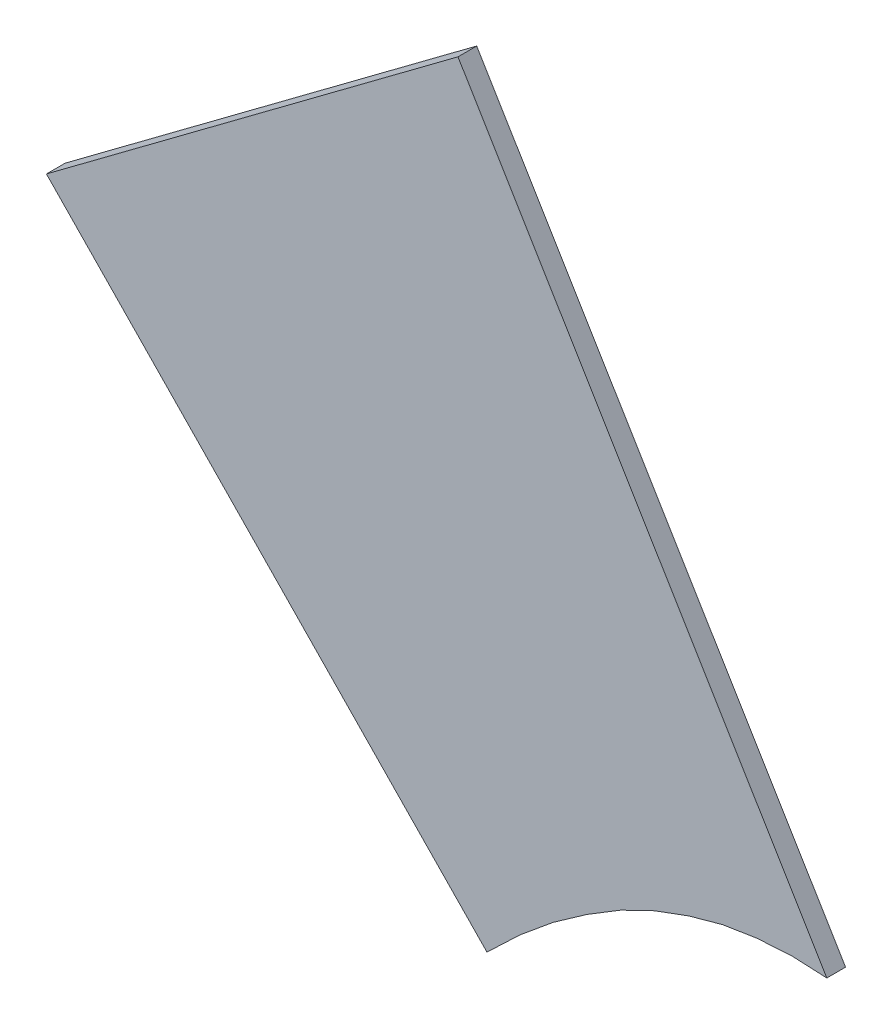
ISO-10303-21;
HEADER;
FILE_DESCRIPTION(('STEP AP214'),'2;1');
FILE_NAME('part.step','',(''),(''),'','','');
FILE_SCHEMA(('AUTOMOTIVE_DESIGN { 1 0 10303 214 1 1 1 1 }'));
ENDSEC;
DATA;
#1=APPLICATION_CONTEXT('core data for automotive mechanical design processes');
#2=APPLICATION_PROTOCOL_DEFINITION('international standard','automotive_design',2000,#1);
#3=PRODUCT_CONTEXT('',#1,'mechanical');
#4=PRODUCT('Part','Part','',(#3));
#5=PRODUCT_RELATED_PRODUCT_CATEGORY('part','',(#4));
#6=PRODUCT_DEFINITION_FORMATION('','',#4);
#7=PRODUCT_DEFINITION_CONTEXT('part definition',#1,'design');
#8=PRODUCT_DEFINITION('design','',#6,#7);
#9=PRODUCT_DEFINITION_SHAPE('','',#8);
#10=(LENGTH_UNIT() NAMED_UNIT(*) SI_UNIT(.MILLI.,.METRE.));
#11=(NAMED_UNIT(*) PLANE_ANGLE_UNIT() SI_UNIT($,.RADIAN.));
#12=(NAMED_UNIT(*) SI_UNIT($,.STERADIAN.) SOLID_ANGLE_UNIT());
#13=UNCERTAINTY_MEASURE_WITH_UNIT(LENGTH_MEASURE(1.E-05),#10,'distance_accuracy_value','');
#14=(GEOMETRIC_REPRESENTATION_CONTEXT(3) GLOBAL_UNCERTAINTY_ASSIGNED_CONTEXT((#13)) GLOBAL_UNIT_ASSIGNED_CONTEXT((#10,
#11,#12)) REPRESENTATION_CONTEXT('',''));
#15=CARTESIAN_POINT('',(0.,0.,0.));
#16=DIRECTION('',(0.,0.,1.));
#17=DIRECTION('',(1.,0.,0.));
#18=AXIS2_PLACEMENT_3D('',#15,#16,#17);
#19=CARTESIAN_POINT('',(35.1240005493164,69.875,0.));
#20=DIRECTION('',(-0.689642033528517,0.724150444031247,0.));
#21=DIRECTION('',(0.724150444031247,0.689642033528517,0.));
#22=AXIS2_PLACEMENT_3D('',#19,#20,#21);
#23=PLANE('',#22);
#24=DIRECTION('',(0.724150444031247,0.689642033528517,0.));
#25=VECTOR('',#24,1.);
#26=CARTESIAN_POINT('',(35.1240005493164,69.875,0.03556));
#27=LINE('',#26,#25);
#28=CARTESIAN_POINT('',(35.1240005493164,69.875,0.03556));
#29=VERTEX_POINT('',#28);
#30=CARTESIAN_POINT('',(35.1870002746582,69.9349975585938,0.03556));
#31=VERTEX_POINT('',#30);
#32=EDGE_CURVE('E11',#29,#31,#27,.T.);
#33=ORIENTED_EDGE('',*,*,#32,.F.);
#34=DIRECTION('',(0.,0.,1.));
#35=VECTOR('',#34,1.);
#36=CARTESIAN_POINT('',(35.1240005493164,69.875,0.));
#37=LINE('',#36,#35);
#38=CARTESIAN_POINT('',(35.1240005493164,69.875,0.));
#39=VERTEX_POINT('',#38);
#40=EDGE_CURVE('E24',#39,#29,#37,.T.);
#41=ORIENTED_EDGE('',*,*,#40,.F.);
#42=DIRECTION('',(0.724150444031247,0.689642033528517,0.));
#43=VECTOR('',#42,1.);
#44=CARTESIAN_POINT('',(35.1240005493164,69.875,0.));
#45=LINE('',#44,#43);
#46=CARTESIAN_POINT('',(35.1870002746582,69.9349975585938,0.));
#47=VERTEX_POINT('',#46);
#48=EDGE_CURVE('E130',#39,#47,#45,.T.);
#49=ORIENTED_EDGE('',*,*,#48,.T.);
#50=DIRECTION('',(0.,0.,1.));
#51=VECTOR('',#50,1.);
#52=CARTESIAN_POINT('',(35.1870002746582,69.9349975585938,0.));
#53=LINE('',#52,#51);
#54=EDGE_CURVE('E37',#47,#31,#53,.T.);
#55=ORIENTED_EDGE('',*,*,#54,.T.);
#56=EDGE_LOOP('',(#33,#41,#49,#55));
#57=FACE_BOUND('',#56,.T.);
#58=ADVANCED_FACE('F17',(#57),#23,.F.);
#59=CARTESIAN_POINT('',(35.1870002746582,69.9349975585938,0.));
#60=DIRECTION('',(-0.636580907801203,0.771209924613913,0.));
#61=DIRECTION('',(0.771209924613913,0.636580907801203,0.));
#62=AXIS2_PLACEMENT_3D('',#59,#60,#61);
#63=PLANE('',#62);
#64=DIRECTION('',(0.771209924613913,0.636580907801203,0.));
#65=VECTOR('',#64,1.);
#66=CARTESIAN_POINT('',(35.1870002746582,69.9349975585938,0.03556));
#67=LINE('',#66,#65);
#68=CARTESIAN_POINT('',(35.25,69.9869995117188,0.03556));
#69=VERTEX_POINT('',#68);
#70=EDGE_CURVE('E210',#31,#69,#67,.T.);
#71=ORIENTED_EDGE('',*,*,#70,.F.);
#72=ORIENTED_EDGE('',*,*,#54,.F.);
#73=DIRECTION('',(0.771209924613913,0.636580907801203,0.));
#74=VECTOR('',#73,1.);
#75=CARTESIAN_POINT('',(35.1870002746582,69.9349975585938,0.));
#76=LINE('',#75,#74);
#77=CARTESIAN_POINT('',(35.25,69.9869995117188,0.));
#78=VERTEX_POINT('',#77);
#79=EDGE_CURVE('E207',#47,#78,#76,.T.);
#80=ORIENTED_EDGE('',*,*,#79,.T.);
#81=DIRECTION('',(0.,0.,1.));
#82=VECTOR('',#81,1.);
#83=CARTESIAN_POINT('',(35.25,69.9869995117188,0.));
#84=LINE('',#83,#82);
#85=EDGE_CURVE('E205',#78,#69,#84,.T.);
#86=ORIENTED_EDGE('',*,*,#85,.T.);
#87=EDGE_LOOP('',(#71,#72,#80,#86));
#88=FACE_BOUND('',#87,.T.);
#89=ADVANCED_FACE('F218',(#88),#63,.F.);
#90=CARTESIAN_POINT('',(35.25,69.9869995117188,0.));
#91=DIRECTION('',(-0.575166045740666,0.818036686113188,0.));
#92=DIRECTION('',(0.818036686113188,0.575166045740666,0.));
#93=AXIS2_PLACEMENT_3D('',#90,#91,#92);
#94=PLANE('',#93);
#95=DIRECTION('',(0.818036686113187,0.575166045740666,0.));
#96=VECTOR('',#95,1.);
#97=CARTESIAN_POINT('',(35.25,69.9869995117188,0.03556));
#98=LINE('',#97,#96);
#99=CARTESIAN_POINT('',(35.3139991760254,70.0319976806641,0.03556));
#100=VERTEX_POINT('',#99);
#101=EDGE_CURVE('E202',#69,#100,#98,.T.);
#102=ORIENTED_EDGE('',*,*,#101,.F.);
#103=ORIENTED_EDGE('',*,*,#85,.F.);
#104=DIRECTION('',(0.818036686113187,0.575166045740666,0.));
#105=VECTOR('',#104,1.);
#106=CARTESIAN_POINT('',(35.25,69.9869995117188,0.));
#107=LINE('',#106,#105);
#108=CARTESIAN_POINT('',(35.3139991760254,70.0319976806641,0.));
#109=VERTEX_POINT('',#108);
#110=EDGE_CURVE('E199',#78,#109,#107,.T.);
#111=ORIENTED_EDGE('',*,*,#110,.T.);
#112=DIRECTION('',(0.,0.,1.));
#113=VECTOR('',#112,1.);
#114=CARTESIAN_POINT('',(35.3139991760254,70.0319976806641,0.));
#115=LINE('',#114,#113);
#116=EDGE_CURVE('E197',#109,#100,#115,.T.);
#117=ORIENTED_EDGE('',*,*,#116,.T.);
#118=EDGE_LOOP('',(#102,#103,#111,#117));
#119=FACE_BOUND('',#118,.T.);
#120=ADVANCED_FACE('F224',(#119),#94,.F.);
#121=CARTESIAN_POINT('',(35.3139991760254,70.0319976806641,0.));
#122=DIRECTION('',(-0.520389310565312,0.853929133739656,0.));
#123=DIRECTION('',(0.853929133739656,0.520389310565312,0.));
#124=AXIS2_PLACEMENT_3D('',#121,#122,#123);
#125=PLANE('',#124);
#126=DIRECTION('',(0.853929133739656,0.520389310565312,0.));
#127=VECTOR('',#126,1.);
#128=CARTESIAN_POINT('',(35.3139991760254,70.0319976806641,0.03556));
#129=LINE('',#128,#127);
#130=CARTESIAN_POINT('',(35.3779983520508,70.0709991455078,0.03556));
#131=VERTEX_POINT('',#130);
#132=EDGE_CURVE('E194',#100,#131,#129,.T.);
#133=ORIENTED_EDGE('',*,*,#132,.F.);
#134=ORIENTED_EDGE('',*,*,#116,.F.);
#135=DIRECTION('',(0.853929133739656,0.520389310565312,0.));
#136=VECTOR('',#135,1.);
#137=CARTESIAN_POINT('',(35.3139991760254,70.0319976806641,0.));
#138=LINE('',#137,#136);
#139=CARTESIAN_POINT('',(35.3779983520508,70.0709991455078,0.));
#140=VERTEX_POINT('',#139);
#141=EDGE_CURVE('E191',#109,#140,#138,.T.);
#142=ORIENTED_EDGE('',*,*,#141,.T.);
#143=DIRECTION('',(0.,0.,1.));
#144=VECTOR('',#143,1.);
#145=CARTESIAN_POINT('',(35.3779983520508,70.0709991455078,0.));
#146=LINE('',#145,#144);
#147=EDGE_CURVE('E189',#140,#131,#146,.T.);
#148=ORIENTED_EDGE('',*,*,#147,.T.);
#149=EDGE_LOOP('',(#133,#134,#142,#148));
#150=FACE_BOUND('',#149,.T.);
#151=ADVANCED_FACE('F226',(#150),#125,.F.);
#152=CARTESIAN_POINT('',(35.3779983520508,70.0709991455078,0.));
#153=DIRECTION('',(-0.435891794193045,0.899999079863512,0.));
#154=DIRECTION('',(0.899999079863512,0.435891794193045,0.));
#155=AXIS2_PLACEMENT_3D('',#152,#153,#154);
#156=PLANE('',#155);
#157=DIRECTION('',(0.899999079863512,0.435891794193045,0.));
#158=VECTOR('',#157,1.);
#159=CARTESIAN_POINT('',(35.3779983520508,70.0709991455078,0.03556));
#160=LINE('',#159,#158);
#161=CARTESIAN_POINT('',(35.4420013427734,70.1019973754883,0.03556));
#162=VERTEX_POINT('',#161);
#163=EDGE_CURVE('E186',#131,#162,#160,.T.);
#164=ORIENTED_EDGE('',*,*,#163,.F.);
#165=ORIENTED_EDGE('',*,*,#147,.F.);
#166=DIRECTION('',(0.899999079863512,0.435891794193045,0.));
#167=VECTOR('',#166,1.);
#168=CARTESIAN_POINT('',(35.3779983520508,70.0709991455078,0.));
#169=LINE('',#168,#167);
#170=CARTESIAN_POINT('',(35.4420013427734,70.1019973754883,0.));
#171=VERTEX_POINT('',#170);
#172=EDGE_CURVE('E183',#140,#171,#169,.T.);
#173=ORIENTED_EDGE('',*,*,#172,.T.);
#174=DIRECTION('',(0.,0.,1.));
#175=VECTOR('',#174,1.);
#176=CARTESIAN_POINT('',(35.4420013427734,70.1019973754883,0.));
#177=LINE('',#176,#175);
#178=EDGE_CURVE('E181',#171,#162,#177,.T.);
#179=ORIENTED_EDGE('',*,*,#178,.T.);
#180=EDGE_LOOP('',(#164,#165,#173,#179));
#181=FACE_BOUND('',#180,.T.);
#182=ADVANCED_FACE('F231',(#181),#156,.F.);
#183=CARTESIAN_POINT('',(35.4420013427734,70.1019973754883,0.));
#184=DIRECTION('',(-0.346406879396561,0.938084363960266,0.));
#185=DIRECTION('',(0.938084363960266,0.346406879396561,0.));
#186=AXIS2_PLACEMENT_3D('',#183,#184,#185);
#187=PLANE('',#186);
#188=DIRECTION('',(0.938084363960266,0.346406879396561,0.));
#189=VECTOR('',#188,1.);
#190=CARTESIAN_POINT('',(35.4420013427734,70.1019973754883,0.03556));
#191=LINE('',#190,#189);
#192=CARTESIAN_POINT('',(35.5069999694824,70.1259994506836,0.03556));
#193=VERTEX_POINT('',#192);
#194=EDGE_CURVE('E178',#162,#193,#191,.T.);
#195=ORIENTED_EDGE('',*,*,#194,.F.);
#196=ORIENTED_EDGE('',*,*,#178,.F.);
#197=DIRECTION('',(0.938084363960266,0.346406879396561,0.));
#198=VECTOR('',#197,1.);
#199=CARTESIAN_POINT('',(35.4420013427734,70.1019973754883,0.));
#200=LINE('',#199,#198);
#201=CARTESIAN_POINT('',(35.5069999694824,70.1259994506836,0.));
#202=VERTEX_POINT('',#201);
#203=EDGE_CURVE('E175',#171,#202,#200,.T.);
#204=ORIENTED_EDGE('',*,*,#203,.T.);
#205=DIRECTION('',(0.,0.,1.));
#206=VECTOR('',#205,1.);
#207=CARTESIAN_POINT('',(35.5069999694824,70.1259994506836,0.));
#208=LINE('',#207,#206);
#209=EDGE_CURVE('E173',#202,#193,#208,.T.);
#210=ORIENTED_EDGE('',*,*,#209,.T.);
#211=EDGE_LOOP('',(#195,#196,#204,#210));
#212=FACE_BOUND('',#211,.T.);
#213=ADVANCED_FACE('F234',(#212),#187,.F.);
#214=CARTESIAN_POINT('',(35.5069999694824,70.1259994506836,0.));
#215=DIRECTION('',(-0.266853220896944,0.963737183311367,0.));
#216=DIRECTION('',(0.963737183311367,0.266853220896944,0.));
#217=AXIS2_PLACEMENT_3D('',#214,#215,#216);
#218=PLANE('',#217);
#219=DIRECTION('',(0.963737183311367,0.266853220896944,0.));
#220=VECTOR('',#219,1.);
#221=CARTESIAN_POINT('',(35.5069999694824,70.1259994506836,0.03556));
#222=LINE('',#221,#220);
#223=CARTESIAN_POINT('',(35.5719985961914,70.1439971923828,0.03556));
#224=VERTEX_POINT('',#223);
#225=EDGE_CURVE('E170',#193,#224,#222,.T.);
#226=ORIENTED_EDGE('',*,*,#225,.F.);
#227=ORIENTED_EDGE('',*,*,#209,.F.);
#228=DIRECTION('',(0.963737183311367,0.266853220896944,0.));
#229=VECTOR('',#228,1.);
#230=CARTESIAN_POINT('',(35.5069999694824,70.1259994506836,0.));
#231=LINE('',#230,#229);
#232=CARTESIAN_POINT('',(35.5719985961914,70.1439971923828,0.));
#233=VERTEX_POINT('',#232);
#234=EDGE_CURVE('E167',#202,#233,#231,.T.);
#235=ORIENTED_EDGE('',*,*,#234,.T.);
#236=DIRECTION('',(0.,0.,1.));
#237=VECTOR('',#236,1.);
#238=CARTESIAN_POINT('',(35.5719985961914,70.1439971923828,0.));
#239=LINE('',#238,#237);
#240=EDGE_CURVE('E165',#233,#224,#239,.T.);
#241=ORIENTED_EDGE('',*,*,#240,.T.);
#242=EDGE_LOOP('',(#226,#227,#235,#241));
#243=FACE_BOUND('',#242,.T.);
#244=ADVANCED_FACE('F239',(#243),#218,.F.);
#245=CARTESIAN_POINT('',(35.5719985961914,70.1439971923828,0.));
#246=DIRECTION('',(-0.152083335751154,0.98836767398919,0.));
#247=DIRECTION('',(0.98836767398919,0.152083335751154,0.));
#248=AXIS2_PLACEMENT_3D('',#245,#246,#247);
#249=PLANE('',#248);
#250=DIRECTION('',(0.98836767398919,0.152083335751153,0.));
#251=VECTOR('',#250,1.);
#252=CARTESIAN_POINT('',(35.5719985961914,70.1439971923828,0.03556));
#253=LINE('',#252,#251);
#254=CARTESIAN_POINT('',(35.6370010375977,70.1539993286133,0.03556));
#255=VERTEX_POINT('',#254);
#256=EDGE_CURVE('E162',#224,#255,#253,.T.);
#257=ORIENTED_EDGE('',*,*,#256,.F.);
#258=ORIENTED_EDGE('',*,*,#240,.F.);
#259=DIRECTION('',(0.98836767398919,0.152083335751153,0.));
#260=VECTOR('',#259,1.);
#261=CARTESIAN_POINT('',(35.5719985961914,70.1439971923828,0.));
#262=LINE('',#261,#260);
#263=CARTESIAN_POINT('',(35.6370010375977,70.1539993286133,0.));
#264=VERTEX_POINT('',#263);
#265=EDGE_CURVE('E159',#233,#264,#262,.T.);
#266=ORIENTED_EDGE('',*,*,#265,.T.);
#267=DIRECTION('',(0.,0.,1.));
#268=VECTOR('',#267,1.);
#269=CARTESIAN_POINT('',(35.6370010375977,70.1539993286133,0.));
#270=LINE('',#269,#268);
#271=EDGE_CURVE('E157',#264,#255,#270,.T.);
#272=ORIENTED_EDGE('',*,*,#271,.T.);
#273=EDGE_LOOP('',(#257,#258,#266,#272));
#274=FACE_BOUND('',#273,.T.);
#275=ADVANCED_FACE('F242',(#274),#249,.F.);
#276=CARTESIAN_POINT('',(35.6370010375977,70.1539993286133,0.));
#277=DIRECTION('',(-0.0604637058805085,0.998170396410951,0.));
#278=DIRECTION('',(0.998170396410951,0.0604637058805085,0.));
#279=AXIS2_PLACEMENT_3D('',#276,#277,#278);
#280=PLANE('',#279);
#281=DIRECTION('',(0.998170396410951,0.0604637058805085,0.));
#282=VECTOR('',#281,1.);
#283=CARTESIAN_POINT('',(35.6370010375977,70.1539993286133,0.03556));
#284=LINE('',#283,#282);
#285=CARTESIAN_POINT('',(35.7029991149902,70.1579971313477,0.03556));
#286=VERTEX_POINT('',#285);
#287=EDGE_CURVE('E154',#255,#286,#284,.T.);
#288=ORIENTED_EDGE('',*,*,#287,.F.);
#289=ORIENTED_EDGE('',*,*,#271,.F.);
#290=DIRECTION('',(0.998170396410951,0.0604637058805085,0.));
#291=VECTOR('',#290,1.);
#292=CARTESIAN_POINT('',(35.6370010375977,70.1539993286133,0.));
#293=LINE('',#292,#291);
#294=CARTESIAN_POINT('',(35.7029991149902,70.1579971313477,0.));
#295=VERTEX_POINT('',#294);
#296=EDGE_CURVE('E151',#264,#295,#293,.T.);
#297=ORIENTED_EDGE('',*,*,#296,.T.);
#298=DIRECTION('',(0.,0.,1.));
#299=VECTOR('',#298,1.);
#300=CARTESIAN_POINT('',(35.7029991149902,70.1579971313477,0.));
#301=LINE('',#300,#299);
#302=EDGE_CURVE('E149',#295,#286,#301,.T.);
#303=ORIENTED_EDGE('',*,*,#302,.T.);
#304=EDGE_LOOP('',(#288,#289,#297,#303));
#305=FACE_BOUND('',#304,.T.);
#306=ADVANCED_FACE('F247',(#305),#280,.F.);
#307=CARTESIAN_POINT('',(35.7029991149902,70.1579971313477,0.));
#308=DIRECTION('',(0.0453814708146965,0.998969730325546,0.));
#309=DIRECTION('',(0.998969730325546,-0.0453814708146965,0.));
#310=AXIS2_PLACEMENT_3D('',#307,#308,#309);
#311=PLANE('',#310);
#312=DIRECTION('',(0.998969730325546,-0.0453814708146965,0.));
#313=VECTOR('',#312,1.);
#314=CARTESIAN_POINT('',(35.7029991149902,70.1579971313477,0.03556));
#315=LINE('',#314,#313);
#316=CARTESIAN_POINT('',(35.7690010070801,70.1549987792969,0.03556));
#317=VERTEX_POINT('',#316);
#318=EDGE_CURVE('E146',#286,#317,#315,.T.);
#319=ORIENTED_EDGE('',*,*,#318,.F.);
#320=ORIENTED_EDGE('',*,*,#302,.F.);
#321=DIRECTION('',(0.998969730325546,-0.0453814708146965,0.));
#322=VECTOR('',#321,1.);
#323=CARTESIAN_POINT('',(35.7029991149902,70.1579971313477,0.));
#324=LINE('',#323,#322);
#325=CARTESIAN_POINT('',(35.7690010070801,70.1549987792969,0.));
#326=VERTEX_POINT('',#325);
#327=EDGE_CURVE('E143',#295,#326,#324,.T.);
#328=ORIENTED_EDGE('',*,*,#327,.T.);
#329=DIRECTION('',(0.,0.,1.));
#330=VECTOR('',#329,1.);
#331=CARTESIAN_POINT('',(35.7690010070801,70.1549987792969,0.));
#332=LINE('',#331,#330);
#333=EDGE_CURVE('E141',#326,#317,#332,.T.);
#334=ORIENTED_EDGE('',*,*,#333,.T.);
#335=EDGE_LOOP('',(#319,#320,#328,#334));
#336=FACE_BOUND('',#335,.T.);
#337=ADVANCED_FACE('F250',(#336),#311,.F.);
#338=CARTESIAN_POINT('',(35.7690010070801,70.1549987792969,0.));
#339=DIRECTION('',(-0.856972834206086,-0.515361583194546,0.));
#340=DIRECTION('',(-0.515361583194546,0.856972834206086,0.));
#341=AXIS2_PLACEMENT_3D('',#338,#339,#340);
#342=PLANE('',#341);
#343=DIRECTION('',(-0.515361583194546,0.856972834206086,0.));
#344=VECTOR('',#343,1.);
#345=CARTESIAN_POINT('',(35.7690010070801,70.1549987792969,0.03556));
#346=LINE('',#345,#344);
#347=CARTESIAN_POINT('',(35.0690002441406,71.3190002441406,0.03556));
#348=VERTEX_POINT('',#347);
#349=EDGE_CURVE('E138',#317,#348,#346,.T.);
#350=ORIENTED_EDGE('',*,*,#349,.F.);
#351=ORIENTED_EDGE('',*,*,#333,.F.);
#352=DIRECTION('',(-0.515361583194546,0.856972834206086,0.));
#353=VECTOR('',#352,1.);
#354=CARTESIAN_POINT('',(35.7690010070801,70.1549987792969,0.));
#355=LINE('',#354,#353);
#356=CARTESIAN_POINT('',(35.0690002441406,71.3190002441406,0.));
#357=VERTEX_POINT('',#356);
#358=EDGE_CURVE('E136',#326,#357,#355,.T.);
#359=ORIENTED_EDGE('',*,*,#358,.T.);
#360=DIRECTION('',(0.,0.,1.));
#361=VECTOR('',#360,1.);
#362=CARTESIAN_POINT('',(35.0690002441406,71.3190002441406,0.));
#363=LINE('',#362,#361);
#364=EDGE_CURVE('E121',#357,#348,#363,.T.);
#365=ORIENTED_EDGE('',*,*,#364,.T.);
#366=EDGE_LOOP('',(#350,#351,#359,#365));
#367=FACE_BOUND('',#366,.T.);
#368=ADVANCED_FACE('F253',(#367),#342,.F.);
#369=CARTESIAN_POINT('',(35.0690002441406,71.3190002441406,0.));
#370=DIRECTION('',(0.598191721826639,-0.801353020795505,0.));
#371=DIRECTION('',(-0.801353020795505,-0.598191721826639,0.));
#372=AXIS2_PLACEMENT_3D('',#369,#370,#371);
#373=PLANE('',#372);
#374=DIRECTION('',(-0.801353020795505,-0.598191721826639,0.));
#375=VECTOR('',#374,1.);
#376=CARTESIAN_POINT('',(35.0690002441406,71.3190002441406,0.03556));
#377=LINE('',#376,#375);
#378=CARTESIAN_POINT('',(34.2879981994629,70.7360000610352,0.03556));
#379=VERTEX_POINT('',#378);
#380=EDGE_CURVE('E125',#348,#379,#377,.T.);
#381=ORIENTED_EDGE('',*,*,#380,.F.);
#382=ORIENTED_EDGE('',*,*,#364,.F.);
#383=DIRECTION('',(-0.801353020795505,-0.598191721826639,0.));
#384=VECTOR('',#383,1.);
#385=CARTESIAN_POINT('',(35.0690002441406,71.3190002441406,0.));
#386=LINE('',#385,#384);
#387=CARTESIAN_POINT('',(34.2879981994629,70.7360000610352,0.));
#388=VERTEX_POINT('',#387);
#389=EDGE_CURVE('E117',#357,#388,#386,.T.);
#390=ORIENTED_EDGE('',*,*,#389,.T.);
#391=DIRECTION('',(0.,0.,1.));
#392=VECTOR('',#391,1.);
#393=CARTESIAN_POINT('',(34.2879981994629,70.7360000610352,0.));
#394=LINE('',#393,#392);
#395=EDGE_CURVE('E107',#388,#379,#394,.T.);
#396=ORIENTED_EDGE('',*,*,#395,.T.);
#397=EDGE_LOOP('',(#381,#382,#390,#396));
#398=FACE_BOUND('',#397,.T.);
#399=ADVANCED_FACE('F120',(#398),#373,.F.);
#400=CARTESIAN_POINT('',(34.2879981994629,70.7360000610352,0.));
#401=DIRECTION('',(0.717444990551354,0.696615163151626,0.));
#402=DIRECTION('',(0.696615163151626,-0.717444990551354,0.));
#403=AXIS2_PLACEMENT_3D('',#400,#401,#402);
#404=PLANE('',#403);
#405=DIRECTION('',(0.696615163151626,-0.717444990551354,0.));
#406=VECTOR('',#405,1.);
#407=CARTESIAN_POINT('',(34.2879981994629,70.7360000610352,0.03556));
#408=LINE('',#407,#406);
#409=EDGE_CURVE('E113',#379,#29,#408,.T.);
#410=ORIENTED_EDGE('',*,*,#409,.F.);
#411=ORIENTED_EDGE('',*,*,#395,.F.);
#412=DIRECTION('',(0.696615163151626,-0.717444990551354,0.));
#413=VECTOR('',#412,1.);
#414=CARTESIAN_POINT('',(34.2879981994629,70.7360000610352,0.));
#415=LINE('',#414,#413);
#416=EDGE_CURVE('E111',#388,#39,#415,.T.);
#417=ORIENTED_EDGE('',*,*,#416,.T.);
#418=ORIENTED_EDGE('',*,*,#40,.T.);
#419=EDGE_LOOP('',(#410,#411,#417,#418));
#420=FACE_BOUND('',#419,.T.);
#421=ADVANCED_FACE('F109',(#420),#404,.F.);
#422=CARTESIAN_POINT('',(35.1240005493164,69.875,0.));
#423=DIRECTION('',(0.,0.,1.));
#424=DIRECTION('',(1.,0.,0.));
#425=AXIS2_PLACEMENT_3D('',#422,#423,#424);
#426=PLANE('',#425);
#427=ORIENTED_EDGE('',*,*,#416,.F.);
#428=ORIENTED_EDGE('',*,*,#389,.F.);
#429=ORIENTED_EDGE('',*,*,#358,.F.);
#430=ORIENTED_EDGE('',*,*,#327,.F.);
#431=ORIENTED_EDGE('',*,*,#296,.F.);
#432=ORIENTED_EDGE('',*,*,#265,.F.);
#433=ORIENTED_EDGE('',*,*,#234,.F.);
#434=ORIENTED_EDGE('',*,*,#203,.F.);
#435=ORIENTED_EDGE('',*,*,#172,.F.);
#436=ORIENTED_EDGE('',*,*,#141,.F.);
#437=ORIENTED_EDGE('',*,*,#110,.F.);
#438=ORIENTED_EDGE('',*,*,#79,.F.);
#439=ORIENTED_EDGE('',*,*,#48,.F.);
#440=EDGE_LOOP('',(#427,#428,#429,#430,#431,#432,#433,#434,#435,#436,#437,#438,#439));
#441=FACE_BOUND('',#440,.T.);
#442=ADVANCED_FACE('F128',(#441),#426,.F.);
#443=CARTESIAN_POINT('',(35.1240005493164,69.875,0.03556));
#444=DIRECTION('',(0.,0.,1.));
#445=DIRECTION('',(1.,0.,0.));
#446=AXIS2_PLACEMENT_3D('',#443,#444,#445);
#447=PLANE('',#446);
#448=ORIENTED_EDGE('',*,*,#32,.T.);
#449=ORIENTED_EDGE('',*,*,#70,.T.);
#450=ORIENTED_EDGE('',*,*,#101,.T.);
#451=ORIENTED_EDGE('',*,*,#132,.T.);
#452=ORIENTED_EDGE('',*,*,#163,.T.);
#453=ORIENTED_EDGE('',*,*,#194,.T.);
#454=ORIENTED_EDGE('',*,*,#225,.T.);
#455=ORIENTED_EDGE('',*,*,#256,.T.);
#456=ORIENTED_EDGE('',*,*,#287,.T.);
#457=ORIENTED_EDGE('',*,*,#318,.T.);
#458=ORIENTED_EDGE('',*,*,#349,.T.);
#459=ORIENTED_EDGE('',*,*,#380,.T.);
#460=ORIENTED_EDGE('',*,*,#409,.T.);
#461=EDGE_LOOP('',(#448,#449,#450,#451,#452,#453,#454,#455,#456,#457,#458,#459,#460));
#462=FACE_BOUND('',#461,.T.);
#463=ADVANCED_FACE('F221',(#462),#447,.T.);
#464=CLOSED_SHELL('',(#58,#89,#120,#151,#182,#213,#244,#275,#306,#337,#368,#399,#421,#442,#463));
#465=MANIFOLD_SOLID_BREP('B1',#464);
#466=ADVANCED_BREP_SHAPE_REPRESENTATION('',(#18,#465),#14);
#467=SHAPE_DEFINITION_REPRESENTATION(#9,#466);
ENDSEC;
END-ISO-10303-21;
